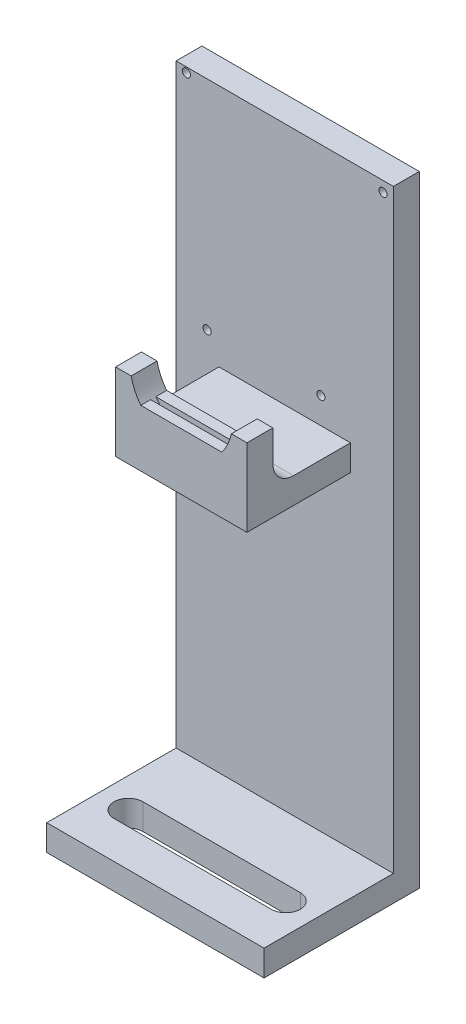
ISO-10303-21;
HEADER;
FILE_DESCRIPTION(('STEP AP214'),'2;1');
FILE_NAME('part.step','',(''),(''),'','','');
FILE_SCHEMA(('AUTOMOTIVE_DESIGN { 1 0 10303 214 1 1 1 1 }'));
ENDSEC;
DATA;
#1=APPLICATION_CONTEXT('core data for automotive mechanical design processes');
#2=APPLICATION_PROTOCOL_DEFINITION('international standard','automotive_design',2000,#1);
#3=PRODUCT_CONTEXT('',#1,'mechanical');
#4=PRODUCT('Part','Part','',(#3));
#5=PRODUCT_RELATED_PRODUCT_CATEGORY('part','',(#4));
#6=PRODUCT_DEFINITION_FORMATION('','',#4);
#7=PRODUCT_DEFINITION_CONTEXT('part definition',#1,'design');
#8=PRODUCT_DEFINITION('design','',#6,#7);
#9=PRODUCT_DEFINITION_SHAPE('','',#8);
#10=(LENGTH_UNIT() NAMED_UNIT(*) SI_UNIT(.MILLI.,.METRE.));
#11=(NAMED_UNIT(*) PLANE_ANGLE_UNIT() SI_UNIT($,.RADIAN.));
#12=(NAMED_UNIT(*) SI_UNIT($,.STERADIAN.) SOLID_ANGLE_UNIT());
#13=UNCERTAINTY_MEASURE_WITH_UNIT(LENGTH_MEASURE(1.E-05),#10,'distance_accuracy_value','');
#14=(GEOMETRIC_REPRESENTATION_CONTEXT(3) GLOBAL_UNCERTAINTY_ASSIGNED_CONTEXT((#13)) GLOBAL_UNIT_ASSIGNED_CONTEXT((#10,
#11,#12)) REPRESENTATION_CONTEXT('',''));
#15=CARTESIAN_POINT('',(0.,0.,0.));
#16=DIRECTION('',(0.,0.,1.));
#17=DIRECTION('',(1.,0.,0.));
#18=AXIS2_PLACEMENT_3D('',#15,#16,#17);
#19=CARTESIAN_POINT('',(0.,0.,6.35));
#20=DIRECTION('',(0.,0.,1.));
#21=DIRECTION('',(1.,0.,0.));
#22=AXIS2_PLACEMENT_3D('',#19,#20,#21);
#23=PLANE('',#22);
#24=CARTESIAN_POINT('',(-41.2214457831326,121.690481927711,6.35));
#25=DIRECTION('',(0.,0.,1.));
#26=DIRECTION('',(1.,0.,0.));
#27=AXIS2_PLACEMENT_3D('',#24,#25,#26);
#28=CIRCLE('',#27,0.999999999999998);
#29=CARTESIAN_POINT('',(-40.2214457831326,121.690481927711,6.35));
#30=VERTEX_POINT('',#29);
#31=EDGE_CURVE('E371',#30,#30,#28,.T.);
#32=ORIENTED_EDGE('',*,*,#31,.F.);
#33=EDGE_LOOP('',(#32));
#34=FACE_BOUND('',#33,.T.);
#35=CARTESIAN_POINT('',(-36.1414457831326,69.6204819277108,6.35));
#36=DIRECTION('',(0.,0.,1.));
#37=DIRECTION('',(1.,0.,0.));
#38=AXIS2_PLACEMENT_3D('',#35,#36,#37);
#39=CIRCLE('',#38,0.999999999999998);
#40=CARTESIAN_POINT('',(-35.1414457831326,69.6204819277108,6.35));
#41=VERTEX_POINT('',#40);
#42=EDGE_CURVE('E387',#41,#41,#39,.T.);
#43=ORIENTED_EDGE('',*,*,#42,.F.);
#44=EDGE_LOOP('',(#43));
#45=FACE_BOUND('',#44,.T.);
#46=CARTESIAN_POINT('',(-8.20144578313258,69.6204819277108,6.35));
#47=DIRECTION('',(0.,0.,1.));
#48=DIRECTION('',(1.,0.,0.));
#49=AXIS2_PLACEMENT_3D('',#46,#47,#48);
#50=CIRCLE('',#49,1.);
#51=CARTESIAN_POINT('',(-7.20144578313259,69.6204819277108,6.35));
#52=VERTEX_POINT('',#51);
#53=EDGE_CURVE('E379',#52,#52,#50,.T.);
#54=ORIENTED_EDGE('',*,*,#53,.F.);
#55=EDGE_LOOP('',(#54));
#56=FACE_BOUND('',#55,.T.);
#57=CARTESIAN_POINT('',(7.0385542168674,120.420481927711,6.35));
#58=DIRECTION('',(0.,0.,1.));
#59=DIRECTION('',(1.,0.,0.));
#60=AXIS2_PLACEMENT_3D('',#57,#58,#59);
#61=CIRCLE('',#60,1.);
#62=CARTESIAN_POINT('',(8.0385542168674,120.420481927711,6.35));
#63=VERTEX_POINT('',#62);
#64=EDGE_CURVE('E363',#63,#63,#61,.T.);
#65=ORIENTED_EDGE('',*,*,#64,.F.);
#66=EDGE_LOOP('',(#65));
#67=FACE_BOUND('',#66,.T.);
#68=DIRECTION('',(-1.,0.,0.));
#69=VECTOR('',#68,1.);
#70=CARTESIAN_POINT('',(0.,56.839063863778,6.35));
#71=LINE('',#70,#69);
#72=CARTESIAN_POINT('',(-0.962445783132593,56.839063863778,6.35));
#73=VERTEX_POINT('',#72);
#74=CARTESIAN_POINT('',(-33.2204457831326,56.839063863778,6.35));
#75=VERTEX_POINT('',#74);
#76=EDGE_CURVE('E354',#73,#75,#71,.T.);
#77=ORIENTED_EDGE('',*,*,#76,.T.);
#78=DIRECTION('',(0.,1.,0.));
#79=VECTOR('',#78,1.);
#80=CARTESIAN_POINT('',(-33.2204457831326,0.,6.35));
#81=LINE('',#80,#79);
#82=CARTESIAN_POINT('',(-33.2204457831326,63.189063863778,6.35));
#83=VERTEX_POINT('',#82);
#84=EDGE_CURVE('E358',#75,#83,#81,.T.);
#85=ORIENTED_EDGE('',*,*,#84,.T.);
#86=DIRECTION('',(1.,0.,0.));
#87=VECTOR('',#86,1.);
#88=CARTESIAN_POINT('',(0.,63.189063863778,6.35));
#89=LINE('',#88,#87);
#90=CARTESIAN_POINT('',(-0.962445783132593,63.189063863778,6.35));
#91=VERTEX_POINT('',#90);
#92=EDGE_CURVE('E346',#83,#91,#89,.T.);
#93=ORIENTED_EDGE('',*,*,#92,.T.);
#94=DIRECTION('',(0.,-1.,0.));
#95=VECTOR('',#94,1.);
#96=CARTESIAN_POINT('',(-0.962445783132593,0.,6.35));
#97=LINE('',#96,#95);
#98=EDGE_CURVE('E350',#91,#73,#97,.T.);
#99=ORIENTED_EDGE('',*,*,#98,.T.);
#100=EDGE_LOOP('',(#77,#85,#93,#99));
#101=FACE_BOUND('',#100,.T.);
#102=DIRECTION('',(0.,-1.,0.));
#103=VECTOR('',#102,1.);
#104=CARTESIAN_POINT('',(-43.7614457831326,122.960481927711,6.35));
#105=LINE('',#104,#103);
#106=CARTESIAN_POINT('',(-43.7614457831326,122.960481927711,6.35));
#107=VERTEX_POINT('',#106);
#108=CARTESIAN_POINT('',(-43.7614457831326,-23.0895180722891,6.35));
#109=VERTEX_POINT('',#108);
#110=EDGE_CURVE('E395',#107,#109,#105,.T.);
#111=ORIENTED_EDGE('',*,*,#110,.T.);
#112=DIRECTION('',(-1.,0.,0.));
#113=VECTOR('',#112,1.);
#114=CARTESIAN_POINT('',(-43.7614457831326,-23.0895180722892,6.35));
#115=LINE('',#114,#113);
#116=CARTESIAN_POINT('',(9.57855421686743,-23.0895180722892,6.35));
#117=VERTEX_POINT('',#116);
#118=EDGE_CURVE('E212',#117,#109,#115,.T.);
#119=ORIENTED_EDGE('',*,*,#118,.F.);
#120=DIRECTION('',(0.,1.,0.));
#121=VECTOR('',#120,1.);
#122=CARTESIAN_POINT('',(9.57855421686741,122.960481927711,6.35));
#123=LINE('',#122,#121);
#124=CARTESIAN_POINT('',(9.57855421686741,122.960481927711,6.35));
#125=VERTEX_POINT('',#124);
#126=EDGE_CURVE('E398',#117,#125,#123,.T.);
#127=ORIENTED_EDGE('',*,*,#126,.T.);
#128=DIRECTION('',(-1.,0.,0.));
#129=VECTOR('',#128,1.);
#130=CARTESIAN_POINT('',(-43.7614457831326,122.960481927711,6.35));
#131=LINE('',#130,#129);
#132=EDGE_CURVE('E402',#125,#107,#131,.T.);
#133=ORIENTED_EDGE('',*,*,#132,.T.);
#134=EDGE_LOOP('',(#111,#119,#127,#133));
#135=FACE_BOUND('',#134,.T.);
#136=ADVANCED_FACE('F41',(#34,#45,#56,#67,#101,#135),#23,.T.);
#137=CARTESIAN_POINT('',(0.,75.889063863778,0.));
#138=DIRECTION('',(0.,-1.,0.));
#139=DIRECTION('',(0.,0.,-1.));
#140=AXIS2_PLACEMENT_3D('',#137,#138,#139);
#141=PLANE('',#140);
#142=DIRECTION('',(-1.,0.,0.));
#143=VECTOR('',#142,1.);
#144=CARTESIAN_POINT('',(-33.2204457831326,75.889063863778,25.4));
#145=LINE('',#144,#143);
#146=CARTESIAN_POINT('',(-0.962445783132593,75.889063863778,25.4));
#147=VERTEX_POINT('',#146);
#148=CARTESIAN_POINT('',(-4.7947593866237,75.889063863778,25.4));
#149=VERTEX_POINT('',#148);
#150=EDGE_CURVE('E311',#147,#149,#145,.T.);
#151=ORIENTED_EDGE('',*,*,#150,.T.);
#152=DIRECTION('',(0.,0.,1.));
#153=VECTOR('',#152,1.);
#154=CARTESIAN_POINT('',(-4.7947593866237,75.889063863778,-0.001000000000001));
#155=LINE('',#154,#153);
#156=CARTESIAN_POINT('',(-4.7947593866237,75.889063863778,31.75));
#157=VERTEX_POINT('',#156);
#158=EDGE_CURVE('E285',#157,#149,#155,.F.);
#159=ORIENTED_EDGE('',*,*,#158,.F.);
#160=DIRECTION('',(1.,0.,0.));
#161=VECTOR('',#160,1.);
#162=CARTESIAN_POINT('',(-33.2204457831326,75.889063863778,31.75));
#163=LINE('',#162,#161);
#164=CARTESIAN_POINT('',(-0.962445783132593,75.889063863778,31.75));
#165=VERTEX_POINT('',#164);
#166=EDGE_CURVE('E302',#157,#165,#163,.T.);
#167=ORIENTED_EDGE('',*,*,#166,.T.);
#168=DIRECTION('',(0.,0.,-1.));
#169=VECTOR('',#168,1.);
#170=CARTESIAN_POINT('',(-0.962445783132593,75.889063863778,31.75));
#171=LINE('',#170,#169);
#172=EDGE_CURVE('E307',#165,#147,#171,.T.);
#173=ORIENTED_EDGE('',*,*,#172,.T.);
#174=EDGE_LOOP('',(#151,#159,#167,#173));
#175=FACE_BOUND('',#174,.T.);
#176=ADVANCED_FACE('F488',(#175),#141,.F.);
#177=CARTESIAN_POINT('',(-33.2204457831326,63.189063863778,31.75));
#178=DIRECTION('',(0.,-1.,0.));
#179=DIRECTION('',(0.,0.,-1.));
#180=AXIS2_PLACEMENT_3D('',#177,#178,#179);
#181=PLANE('',#180);
#182=DIRECTION('',(0.,0.,-1.));
#183=VECTOR('',#182,1.);
#184=CARTESIAN_POINT('',(-33.2204457831326,63.189063863778,31.75));
#185=LINE('',#184,#183);
#186=CARTESIAN_POINT('',(-33.2204457831326,63.189063863778,20.32));
#187=VERTEX_POINT('',#186);
#188=EDGE_CURVE('E332',#187,#83,#185,.T.);
#189=ORIENTED_EDGE('',*,*,#188,.F.);
#190=DIRECTION('',(-1.,0.,0.));
#191=VECTOR('',#190,1.);
#192=CARTESIAN_POINT('',(-0.962445783132593,63.189063863778,20.32));
#193=LINE('',#192,#191);
#194=CARTESIAN_POINT('',(-0.962445783132593,63.189063863778,20.32));
#195=VERTEX_POINT('',#194);
#196=EDGE_CURVE('E459',#187,#195,#193,.F.);
#197=ORIENTED_EDGE('',*,*,#196,.T.);
#198=DIRECTION('',(0.,0.,-1.));
#199=VECTOR('',#198,1.);
#200=CARTESIAN_POINT('',(-0.962445783132593,63.189063863778,31.75));
#201=LINE('',#200,#199);
#202=EDGE_CURVE('E335',#195,#91,#201,.T.);
#203=ORIENTED_EDGE('',*,*,#202,.T.);
#204=ORIENTED_EDGE('',*,*,#92,.F.);
#205=EDGE_LOOP('',(#189,#197,#203,#204));
#206=FACE_BOUND('',#205,.T.);
#207=ADVANCED_FACE('F473',(#206),#181,.F.);
#208=CARTESIAN_POINT('',(0.,0.,0.));
#209=DIRECTION('',(0.,0.,1.));
#210=DIRECTION('',(1.,0.,0.));
#211=AXIS2_PLACEMENT_3D('',#208,#209,#210);
#212=PLANE('',#211);
#213=CARTESIAN_POINT('',(7.0385542168674,120.420481927711,0.));
#214=DIRECTION('',(0.,0.,1.));
#215=DIRECTION('',(1.,0.,0.));
#216=AXIS2_PLACEMENT_3D('',#213,#214,#215);
#217=CIRCLE('',#216,1.);
#218=CARTESIAN_POINT('',(8.0385542168674,120.420481927711,0.));
#219=VERTEX_POINT('',#218);
#220=EDGE_CURVE('E362',#219,#219,#217,.T.);
#221=ORIENTED_EDGE('',*,*,#220,.T.);
#222=EDGE_LOOP('',(#221));
#223=FACE_BOUND('',#222,.T.);
#224=CARTESIAN_POINT('',(-41.2214457831326,121.690481927711,0.));
#225=DIRECTION('',(0.,0.,1.));
#226=DIRECTION('',(1.,0.,0.));
#227=AXIS2_PLACEMENT_3D('',#224,#225,#226);
#228=CIRCLE('',#227,0.999999999999998);
#229=CARTESIAN_POINT('',(-40.2214457831326,121.690481927711,0.));
#230=VERTEX_POINT('',#229);
#231=EDGE_CURVE('E367',#230,#230,#228,.T.);
#232=ORIENTED_EDGE('',*,*,#231,.T.);
#233=EDGE_LOOP('',(#232));
#234=FACE_BOUND('',#233,.T.);
#235=CARTESIAN_POINT('',(-8.20144578313258,69.6204819277108,0.));
#236=DIRECTION('',(0.,0.,1.));
#237=DIRECTION('',(1.,0.,0.));
#238=AXIS2_PLACEMENT_3D('',#235,#236,#237);
#239=CIRCLE('',#238,1.);
#240=CARTESIAN_POINT('',(-7.20144578313259,69.6204819277108,0.));
#241=VERTEX_POINT('',#240);
#242=EDGE_CURVE('E375',#241,#241,#239,.T.);
#243=ORIENTED_EDGE('',*,*,#242,.T.);
#244=EDGE_LOOP('',(#243));
#245=FACE_BOUND('',#244,.T.);
#246=CARTESIAN_POINT('',(-36.1414457831326,69.6204819277108,0.));
#247=DIRECTION('',(0.,0.,1.));
#248=DIRECTION('',(1.,0.,0.));
#249=AXIS2_PLACEMENT_3D('',#246,#247,#248);
#250=CIRCLE('',#249,0.999999999999998);
#251=CARTESIAN_POINT('',(-35.1414457831326,69.6204819277108,0.));
#252=VERTEX_POINT('',#251);
#253=EDGE_CURVE('E383',#252,#252,#250,.T.);
#254=ORIENTED_EDGE('',*,*,#253,.T.);
#255=EDGE_LOOP('',(#254));
#256=FACE_BOUND('',#255,.T.);
#257=DIRECTION('',(0.,-1.,0.));
#258=VECTOR('',#257,1.);
#259=CARTESIAN_POINT('',(-43.7614457831326,122.960481927711,0.));
#260=LINE('',#259,#258);
#261=CARTESIAN_POINT('',(-43.7614457831326,122.960481927711,0.));
#262=VERTEX_POINT('',#261);
#263=CARTESIAN_POINT('',(-43.7614457831326,-29.4395180722892,0.));
#264=VERTEX_POINT('',#263);
#265=EDGE_CURVE('E391',#262,#264,#260,.T.);
#266=ORIENTED_EDGE('',*,*,#265,.F.);
#267=DIRECTION('',(-1.,0.,0.));
#268=VECTOR('',#267,1.);
#269=CARTESIAN_POINT('',(-43.7614457831326,122.960481927711,0.));
#270=LINE('',#269,#268);
#271=CARTESIAN_POINT('',(9.57855421686741,122.960481927711,0.));
#272=VERTEX_POINT('',#271);
#273=EDGE_CURVE('E399',#272,#262,#270,.T.);
#274=ORIENTED_EDGE('',*,*,#273,.F.);
#275=DIRECTION('',(0.,1.,0.));
#276=VECTOR('',#275,1.);
#277=CARTESIAN_POINT('',(9.57855421686741,122.960481927711,0.));
#278=LINE('',#277,#276);
#279=CARTESIAN_POINT('',(9.57855421686743,-29.4395180722892,0.));
#280=VERTEX_POINT('',#279);
#281=EDGE_CURVE('E412',#280,#272,#278,.T.);
#282=ORIENTED_EDGE('',*,*,#281,.F.);
#283=DIRECTION('',(1.,0.,0.));
#284=VECTOR('',#283,1.);
#285=CARTESIAN_POINT('',(-43.7614457831326,-29.4395180722892,0.));
#286=LINE('',#285,#284);
#287=EDGE_CURVE('E409',#264,#280,#286,.T.);
#288=ORIENTED_EDGE('',*,*,#287,.F.);
#289=EDGE_LOOP('',(#266,#274,#282,#288));
#290=FACE_BOUND('',#289,.T.);
#291=ADVANCED_FACE('F545',(#223,#234,#245,#256,#290),#212,.F.);
#292=CARTESIAN_POINT('',(-43.7614457831326,122.960481927711,6.35));
#293=DIRECTION('',(1.,0.,0.));
#294=DIRECTION('',(0.,1.,0.));
#295=AXIS2_PLACEMENT_3D('',#292,#293,#294);
#296=PLANE('',#295);
#297=ORIENTED_EDGE('',*,*,#265,.T.);
#298=DIRECTION('',(0.,0.,-1.));
#299=VECTOR('',#298,1.);
#300=CARTESIAN_POINT('',(-43.7614457831326,-29.4395180722892,6.35));
#301=LINE('',#300,#299);
#302=CARTESIAN_POINT('',(-43.7614457831326,-29.4395180722892,38.1));
#303=VERTEX_POINT('',#302);
#304=EDGE_CURVE('E428',#303,#264,#301,.T.);
#305=ORIENTED_EDGE('',*,*,#304,.F.);
#306=DIRECTION('',(0.,-1.,0.));
#307=VECTOR('',#306,1.);
#308=CARTESIAN_POINT('',(-43.7614457831326,-29.4395180722892,38.1));
#309=LINE('',#308,#307);
#310=CARTESIAN_POINT('',(-43.7614457831326,-23.0895180722892,38.1));
#311=VERTEX_POINT('',#310);
#312=EDGE_CURVE('E244',#311,#303,#309,.T.);
#313=ORIENTED_EDGE('',*,*,#312,.F.);
#314=DIRECTION('',(0.,0.,-1.));
#315=VECTOR('',#314,1.);
#316=CARTESIAN_POINT('',(-43.7614457831326,-23.0895180722892,38.1));
#317=LINE('',#316,#315);
#318=EDGE_CURVE('E258',#311,#109,#317,.T.);
#319=ORIENTED_EDGE('',*,*,#318,.T.);
#320=ORIENTED_EDGE('',*,*,#110,.F.);
#321=DIRECTION('',(0.,0.,-1.));
#322=VECTOR('',#321,1.);
#323=CARTESIAN_POINT('',(-43.7614457831326,122.960481927711,6.35));
#324=LINE('',#323,#322);
#325=EDGE_CURVE('E405',#107,#262,#324,.T.);
#326=ORIENTED_EDGE('',*,*,#325,.T.);
#327=EDGE_LOOP('',(#297,#305,#313,#319,#320,#326));
#328=FACE_BOUND('',#327,.T.);
#329=ADVANCED_FACE('F548',(#328),#296,.F.);
#330=CARTESIAN_POINT('',(-43.7614457831326,-29.4395180722892,6.35));
#331=DIRECTION('',(0.,1.,0.));
#332=DIRECTION('',(0.,0.,1.));
#333=AXIS2_PLACEMENT_3D('',#330,#331,#332);
#334=PLANE('',#333);
#335=DIRECTION('',(1.,0.,0.));
#336=VECTOR('',#335,1.);
#337=CARTESIAN_POINT('',(-36.3954457831326,-29.4395180722892,21.844));
#338=LINE('',#337,#336);
#339=CARTESIAN_POINT('',(-36.3954457831326,-29.4395180722892,21.844));
#340=VERTEX_POINT('',#339);
#341=CARTESIAN_POINT('',(2.21255421686743,-29.4395180722892,21.844));
#342=VERTEX_POINT('',#341);
#343=EDGE_CURVE('E218',#340,#342,#338,.T.);
#344=ORIENTED_EDGE('',*,*,#343,.F.);
#345=CARTESIAN_POINT('',(-36.3954457831326,-29.4395180722892,25.4));
#346=DIRECTION('',(0.,1.,0.));
#347=DIRECTION('',(0.,0.,1.));
#348=AXIS2_PLACEMENT_3D('',#345,#346,#347);
#349=CIRCLE('',#348,3.55600000000001);
#350=CARTESIAN_POINT('',(-36.3954457831326,-29.4395180722892,28.956));
#351=VERTEX_POINT('',#350);
#352=EDGE_CURVE('E198',#351,#340,#349,.F.);
#353=ORIENTED_EDGE('',*,*,#352,.F.);
#354=DIRECTION('',(-1.,0.,0.));
#355=VECTOR('',#354,1.);
#356=CARTESIAN_POINT('',(-36.3954457831326,-29.4395180722892,28.956));
#357=LINE('',#356,#355);
#358=CARTESIAN_POINT('',(2.21255421686743,-29.4395180722892,28.956));
#359=VERTEX_POINT('',#358);
#360=EDGE_CURVE('E208',#359,#351,#357,.T.);
#361=ORIENTED_EDGE('',*,*,#360,.F.);
#362=CARTESIAN_POINT('',(2.21255421686743,-29.4395180722892,25.4));
#363=DIRECTION('',(0.,1.,0.));
#364=DIRECTION('',(0.,0.,1.));
#365=AXIS2_PLACEMENT_3D('',#362,#363,#364);
#366=CIRCLE('',#365,3.556);
#367=EDGE_CURVE('E57',#342,#359,#366,.F.);
#368=ORIENTED_EDGE('',*,*,#367,.F.);
#369=EDGE_LOOP('',(#344,#353,#361,#368));
#370=FACE_BOUND('',#369,.T.);
#371=ORIENTED_EDGE('',*,*,#287,.T.);
#372=DIRECTION('',(0.,0.,-1.));
#373=VECTOR('',#372,1.);
#374=CARTESIAN_POINT('',(9.57855421686743,-29.4395180722892,6.35));
#375=LINE('',#374,#373);
#376=CARTESIAN_POINT('',(9.57855421686743,-29.4395180722892,38.1));
#377=VERTEX_POINT('',#376);
#378=EDGE_CURVE('E424',#377,#280,#375,.T.);
#379=ORIENTED_EDGE('',*,*,#378,.F.);
#380=DIRECTION('',(1.,0.,0.));
#381=VECTOR('',#380,1.);
#382=CARTESIAN_POINT('',(-43.7614457831326,-29.4395180722892,38.1));
#383=LINE('',#382,#381);
#384=EDGE_CURVE('E248',#303,#377,#383,.T.);
#385=ORIENTED_EDGE('',*,*,#384,.F.);
#386=ORIENTED_EDGE('',*,*,#304,.T.);
#387=EDGE_LOOP('',(#371,#379,#385,#386));
#388=FACE_BOUND('',#387,.T.);
#389=ADVANCED_FACE('F215',(#370,#388),#334,.F.);
#390=CARTESIAN_POINT('',(9.57855421686741,122.960481927711,6.35));
#391=DIRECTION('',(-1.,0.,0.));
#392=DIRECTION('',(0.,-1.,0.));
#393=AXIS2_PLACEMENT_3D('',#390,#391,#392);
#394=PLANE('',#393);
#395=ORIENTED_EDGE('',*,*,#281,.T.);
#396=DIRECTION('',(0.,0.,-1.));
#397=VECTOR('',#396,1.);
#398=CARTESIAN_POINT('',(9.57855421686741,122.960481927711,6.35));
#399=LINE('',#398,#397);
#400=EDGE_CURVE('E420',#125,#272,#399,.T.);
#401=ORIENTED_EDGE('',*,*,#400,.F.);
#402=ORIENTED_EDGE('',*,*,#126,.F.);
#403=DIRECTION('',(0.,0.,-1.));
#404=VECTOR('',#403,1.);
#405=CARTESIAN_POINT('',(9.57855421686743,-23.0895180722892,38.1));
#406=LINE('',#405,#404);
#407=CARTESIAN_POINT('',(9.57855421686743,-23.0895180722892,38.1));
#408=VERTEX_POINT('',#407);
#409=EDGE_CURVE('E265',#408,#117,#406,.T.);
#410=ORIENTED_EDGE('',*,*,#409,.F.);
#411=DIRECTION('',(0.,1.,0.));
#412=VECTOR('',#411,1.);
#413=CARTESIAN_POINT('',(9.57855421686743,-29.4395180722892,38.1));
#414=LINE('',#413,#412);
#415=EDGE_CURVE('E252',#377,#408,#414,.T.);
#416=ORIENTED_EDGE('',*,*,#415,.F.);
#417=ORIENTED_EDGE('',*,*,#378,.T.);
#418=EDGE_LOOP('',(#395,#401,#402,#410,#416,#417));
#419=FACE_BOUND('',#418,.T.);
#420=ADVANCED_FACE('F553',(#419),#394,.F.);
#421=CARTESIAN_POINT('',(-43.7614457831326,122.960481927711,6.35));
#422=DIRECTION('',(0.,-1.,0.));
#423=DIRECTION('',(0.,0.,-1.));
#424=AXIS2_PLACEMENT_3D('',#421,#422,#423);
#425=PLANE('',#424);
#426=ORIENTED_EDGE('',*,*,#273,.T.);
#427=ORIENTED_EDGE('',*,*,#325,.F.);
#428=ORIENTED_EDGE('',*,*,#132,.F.);
#429=ORIENTED_EDGE('',*,*,#400,.T.);
#430=EDGE_LOOP('',(#426,#427,#428,#429));
#431=FACE_BOUND('',#430,.T.);
#432=ADVANCED_FACE('F550',(#431),#425,.F.);
#433=CARTESIAN_POINT('',(-36.1414457831326,69.6204819277108,6.35));
#434=DIRECTION('',(0.,0.,-1.));
#435=DIRECTION('',(-1.,0.,0.));
#436=AXIS2_PLACEMENT_3D('',#433,#434,#435);
#437=CYLINDRICAL_SURFACE('',#436,0.999999999999998);
#438=ORIENTED_EDGE('',*,*,#42,.T.);
#439=EDGE_LOOP('',(#438));
#440=FACE_BOUND('',#439,.T.);
#441=ORIENTED_EDGE('',*,*,#253,.F.);
#442=EDGE_LOOP('',(#441));
#443=FACE_BOUND('',#442,.T.);
#444=ADVANCED_FACE('F543',(#440,#443),#437,.F.);
#445=CARTESIAN_POINT('',(-8.20144578313258,69.6204819277108,6.35));
#446=DIRECTION('',(0.,0.,-1.));
#447=DIRECTION('',(-1.,0.,0.));
#448=AXIS2_PLACEMENT_3D('',#445,#446,#447);
#449=CYLINDRICAL_SURFACE('',#448,1.);
#450=ORIENTED_EDGE('',*,*,#53,.T.);
#451=EDGE_LOOP('',(#450));
#452=FACE_BOUND('',#451,.T.);
#453=ORIENTED_EDGE('',*,*,#242,.F.);
#454=EDGE_LOOP('',(#453));
#455=FACE_BOUND('',#454,.T.);
#456=ADVANCED_FACE('F708',(#452,#455),#449,.F.);
#457=CARTESIAN_POINT('',(-41.2214457831326,121.690481927711,6.35));
#458=DIRECTION('',(0.,0.,-1.));
#459=DIRECTION('',(-1.,0.,0.));
#460=AXIS2_PLACEMENT_3D('',#457,#458,#459);
#461=CYLINDRICAL_SURFACE('',#460,0.999999999999998);
#462=ORIENTED_EDGE('',*,*,#31,.T.);
#463=EDGE_LOOP('',(#462));
#464=FACE_BOUND('',#463,.T.);
#465=ORIENTED_EDGE('',*,*,#231,.F.);
#466=EDGE_LOOP('',(#465));
#467=FACE_BOUND('',#466,.T.);
#468=ADVANCED_FACE('F716',(#464,#467),#461,.F.);
#469=CARTESIAN_POINT('',(7.0385542168674,120.420481927711,6.35));
#470=DIRECTION('',(0.,0.,-1.));
#471=DIRECTION('',(-1.,0.,0.));
#472=AXIS2_PLACEMENT_3D('',#469,#470,#471);
#473=CYLINDRICAL_SURFACE('',#472,1.);
#474=ORIENTED_EDGE('',*,*,#64,.T.);
#475=EDGE_LOOP('',(#474));
#476=FACE_BOUND('',#475,.T.);
#477=ORIENTED_EDGE('',*,*,#220,.F.);
#478=EDGE_LOOP('',(#477));
#479=FACE_BOUND('',#478,.T.);
#480=ADVANCED_FACE('F724',(#476,#479),#473,.F.);
#481=CARTESIAN_POINT('',(-33.2204457831326,63.189063863778,31.75));
#482=DIRECTION('',(1.,0.,0.));
#483=DIRECTION('',(0.,0.,-1.));
#484=AXIS2_PLACEMENT_3D('',#481,#482,#483);
#485=PLANE('',#484);
#486=DIRECTION('',(0.,0.,-1.));
#487=VECTOR('',#486,1.);
#488=CARTESIAN_POINT('',(-33.2204457831326,56.839063863778,31.75));
#489=LINE('',#488,#487);
#490=CARTESIAN_POINT('',(-33.2204457831326,56.839063863778,31.75));
#491=VERTEX_POINT('',#490);
#492=EDGE_CURVE('E342',#491,#75,#489,.T.);
#493=ORIENTED_EDGE('',*,*,#492,.F.);
#494=DIRECTION('',(0.,-1.,0.));
#495=VECTOR('',#494,1.);
#496=CARTESIAN_POINT('',(-33.2204457831326,63.189063863778,31.75));
#497=LINE('',#496,#495);
#498=CARTESIAN_POINT('',(-33.2204457831326,75.889063863778,31.75));
#499=VERTEX_POINT('',#498);
#500=EDGE_CURVE('E323',#499,#491,#497,.T.);
#501=ORIENTED_EDGE('',*,*,#500,.F.);
#502=DIRECTION('',(0.,0.,1.));
#503=VECTOR('',#502,1.);
#504=CARTESIAN_POINT('',(-33.2204457831326,75.889063863778,31.75));
#505=LINE('',#504,#503);
#506=CARTESIAN_POINT('',(-33.2204457831326,75.889063863778,25.4));
#507=VERTEX_POINT('',#506);
#508=EDGE_CURVE('E298',#507,#499,#505,.T.);
#509=ORIENTED_EDGE('',*,*,#508,.F.);
#510=DIRECTION('',(0.,-1.,0.));
#511=VECTOR('',#510,1.);
#512=CARTESIAN_POINT('',(-33.2204457831326,75.889063863778,25.4));
#513=LINE('',#512,#511);
#514=CARTESIAN_POINT('',(-33.2204457831326,68.269063863778,25.4));
#515=VERTEX_POINT('',#514);
#516=EDGE_CURVE('E315',#507,#515,#513,.T.);
#517=ORIENTED_EDGE('',*,*,#516,.T.);
#518=CARTESIAN_POINT('',(-33.2204457831326,68.269063863778,20.32));
#519=DIRECTION('',(1.,0.,0.));
#520=DIRECTION('',(0.,0.,-1.));
#521=AXIS2_PLACEMENT_3D('',#518,#519,#520);
#522=CIRCLE('',#521,5.08);
#523=EDGE_CURVE('E50',#515,#187,#522,.T.);
#524=ORIENTED_EDGE('',*,*,#523,.T.);
#525=ORIENTED_EDGE('',*,*,#188,.T.);
#526=ORIENTED_EDGE('',*,*,#84,.F.);
#527=EDGE_LOOP('',(#493,#501,#509,#517,#524,#525,#526));
#528=FACE_BOUND('',#527,.T.);
#529=ADVANCED_FACE('F465',(#528),#485,.F.);
#530=CARTESIAN_POINT('',(-33.2204457831326,56.839063863778,31.75));
#531=DIRECTION('',(0.,1.,0.));
#532=DIRECTION('',(-1.,0.,0.));
#533=AXIS2_PLACEMENT_3D('',#530,#531,#532);
#534=PLANE('',#533);
#535=ORIENTED_EDGE('',*,*,#76,.F.);
#536=DIRECTION('',(0.,0.,-1.));
#537=VECTOR('',#536,1.);
#538=CARTESIAN_POINT('',(-0.962445783132593,56.839063863778,31.75));
#539=LINE('',#538,#537);
#540=CARTESIAN_POINT('',(-0.962445783132593,56.839063863778,31.75));
#541=VERTEX_POINT('',#540);
#542=EDGE_CURVE('E338',#541,#73,#539,.T.);
#543=ORIENTED_EDGE('',*,*,#542,.F.);
#544=DIRECTION('',(1.,0.,0.));
#545=VECTOR('',#544,1.);
#546=CARTESIAN_POINT('',(-33.2204457831326,56.839063863778,31.75));
#547=LINE('',#546,#545);
#548=EDGE_CURVE('E326',#491,#541,#547,.T.);
#549=ORIENTED_EDGE('',*,*,#548,.F.);
#550=ORIENTED_EDGE('',*,*,#492,.T.);
#551=EDGE_LOOP('',(#535,#543,#549,#550));
#552=FACE_BOUND('',#551,.T.);
#553=ADVANCED_FACE('F499',(#552),#534,.F.);
#554=CARTESIAN_POINT('',(-0.962445783132593,63.189063863778,31.75));
#555=DIRECTION('',(-1.,0.,0.));
#556=DIRECTION('',(0.,0.,1.));
#557=AXIS2_PLACEMENT_3D('',#554,#555,#556);
#558=PLANE('',#557);
#559=ORIENTED_EDGE('',*,*,#172,.F.);
#560=DIRECTION('',(0.,1.,0.));
#561=VECTOR('',#560,1.);
#562=CARTESIAN_POINT('',(-0.962445783132593,63.189063863778,31.75));
#563=LINE('',#562,#561);
#564=EDGE_CURVE('E329',#541,#165,#563,.T.);
#565=ORIENTED_EDGE('',*,*,#564,.F.);
#566=ORIENTED_EDGE('',*,*,#542,.T.);
#567=ORIENTED_EDGE('',*,*,#98,.F.);
#568=ORIENTED_EDGE('',*,*,#202,.F.);
#569=CARTESIAN_POINT('',(-0.962445783132593,68.269063863778,20.32));
#570=DIRECTION('',(-1.,0.,0.));
#571=DIRECTION('',(0.,0.,1.));
#572=AXIS2_PLACEMENT_3D('',#569,#570,#571);
#573=CIRCLE('',#572,5.08);
#574=CARTESIAN_POINT('',(-0.962445783132593,68.269063863778,25.4));
#575=VERTEX_POINT('',#574);
#576=EDGE_CURVE('E11',#195,#575,#573,.T.);
#577=ORIENTED_EDGE('',*,*,#576,.T.);
#578=DIRECTION('',(0.,-1.,0.));
#579=VECTOR('',#578,1.);
#580=CARTESIAN_POINT('',(-0.962445783132593,75.889063863778,25.4));
#581=LINE('',#580,#579);
#582=EDGE_CURVE('E319',#147,#575,#581,.T.);
#583=ORIENTED_EDGE('',*,*,#582,.F.);
#584=EDGE_LOOP('',(#559,#565,#566,#567,#568,#577,#583));
#585=FACE_BOUND('',#584,.T.);
#586=ADVANCED_FACE('F479',(#585),#558,.F.);
#587=CARTESIAN_POINT('',(0.,0.,31.75));
#588=DIRECTION('',(0.,0.,1.));
#589=DIRECTION('',(1.,0.,0.));
#590=AXIS2_PLACEMENT_3D('',#587,#588,#589);
#591=PLANE('',#590);
#592=ORIENTED_EDGE('',*,*,#500,.T.);
#593=ORIENTED_EDGE('',*,*,#548,.T.);
#594=ORIENTED_EDGE('',*,*,#564,.T.);
#595=ORIENTED_EDGE('',*,*,#166,.F.);
#596=CARTESIAN_POINT('',(-17.0914457831326,78.5104819277108,31.75));
#597=DIRECTION('',(0.,0.,1.));
#598=DIRECTION('',(1.,0.,0.));
#599=AXIS2_PLACEMENT_3D('',#596,#597,#598);
#600=CIRCLE('',#599,12.573);
#601=CARTESIAN_POINT('',(-7.15321209678122,70.809063863778,31.75));
#602=VERTEX_POINT('',#601);
#603=EDGE_CURVE('E288',#602,#157,#600,.T.);
#604=ORIENTED_EDGE('',*,*,#603,.F.);
#605=DIRECTION('',(1.,0.,0.));
#606=VECTOR('',#605,1.);
#607=CARTESIAN_POINT('',(-0.962445783132593,70.809063863778,31.75));
#608=LINE('',#607,#606);
#609=CARTESIAN_POINT('',(-27.0296794694839,70.809063863778,31.75));
#610=VERTEX_POINT('',#609);
#611=EDGE_CURVE('E273',#610,#602,#608,.T.);
#612=ORIENTED_EDGE('',*,*,#611,.F.);
#613=CARTESIAN_POINT('',(-29.3881321796415,75.889063863778,31.75));
#614=VERTEX_POINT('',#613);
#615=EDGE_CURVE('E289',#614,#610,#600,.T.);
#616=ORIENTED_EDGE('',*,*,#615,.F.);
#617=EDGE_CURVE('E303',#499,#614,#163,.T.);
#618=ORIENTED_EDGE('',*,*,#617,.F.);
#619=EDGE_LOOP('',(#592,#593,#594,#595,#604,#612,#616,#618));
#620=FACE_BOUND('',#619,.T.);
#621=ADVANCED_FACE('F494',(#620),#591,.T.);
#622=CARTESIAN_POINT('',(-33.2204457831326,75.889063863778,25.4));
#623=DIRECTION('',(0.,0.,1.));
#624=DIRECTION('',(1.,0.,0.));
#625=AXIS2_PLACEMENT_3D('',#622,#623,#624);
#626=PLANE('',#625);
#627=ORIENTED_EDGE('',*,*,#582,.T.);
#628=DIRECTION('',(-1.,0.,0.));
#629=VECTOR('',#628,1.);
#630=CARTESIAN_POINT('',(-33.2204457831326,68.269063863778,25.4));
#631=LINE('',#630,#629);
#632=EDGE_CURVE('E455',#575,#515,#631,.T.);
#633=ORIENTED_EDGE('',*,*,#632,.T.);
#634=ORIENTED_EDGE('',*,*,#516,.F.);
#635=CARTESIAN_POINT('',(-29.3881321796415,75.889063863778,25.4));
#636=VERTEX_POINT('',#635);
#637=EDGE_CURVE('E310',#636,#507,#145,.T.);
#638=ORIENTED_EDGE('',*,*,#637,.F.);
#639=CARTESIAN_POINT('',(-17.0914457831326,78.5104819277108,25.4));
#640=DIRECTION('',(0.,0.,1.));
#641=DIRECTION('',(1.,0.,0.));
#642=AXIS2_PLACEMENT_3D('',#639,#640,#641);
#643=CIRCLE('',#642,12.573);
#644=CARTESIAN_POINT('',(-27.0296794694839,70.809063863778,25.4));
#645=VERTEX_POINT('',#644);
#646=EDGE_CURVE('E293',#645,#636,#643,.F.);
#647=ORIENTED_EDGE('',*,*,#646,.F.);
#648=DIRECTION('',(-1.,0.,0.));
#649=VECTOR('',#648,1.);
#650=CARTESIAN_POINT('',(-33.2204457831326,70.809063863778,25.4));
#651=LINE('',#650,#649);
#652=CARTESIAN_POINT('',(-7.15321209678122,70.809063863778,25.4));
#653=VERTEX_POINT('',#652);
#654=EDGE_CURVE('E279',#653,#645,#651,.T.);
#655=ORIENTED_EDGE('',*,*,#654,.F.);
#656=EDGE_CURVE('E294',#149,#653,#643,.F.);
#657=ORIENTED_EDGE('',*,*,#656,.F.);
#658=ORIENTED_EDGE('',*,*,#150,.F.);
#659=EDGE_LOOP('',(#627,#633,#634,#638,#647,#655,#657,#658));
#660=FACE_BOUND('',#659,.T.);
#661=ADVANCED_FACE('F483',(#660),#626,.F.);
#662=ORIENTED_EDGE('',*,*,#617,.T.);
#663=DIRECTION('',(0.,0.,1.));
#664=VECTOR('',#663,1.);
#665=CARTESIAN_POINT('',(-29.3881321796415,75.889063863778,-0.001000000000001));
#666=LINE('',#665,#664);
#667=EDGE_CURVE('E282',#636,#614,#666,.T.);
#668=ORIENTED_EDGE('',*,*,#667,.F.);
#669=ORIENTED_EDGE('',*,*,#637,.T.);
#670=ORIENTED_EDGE('',*,*,#508,.T.);
#671=EDGE_LOOP('',(#662,#668,#669,#670));
#672=FACE_BOUND('',#671,.T.);
#673=ADVANCED_FACE('F506',(#672),#141,.F.);
#674=CARTESIAN_POINT('',(-17.0914457831326,78.5104819277108,-0.001000000000001));
#675=DIRECTION('',(0.,0.,1.));
#676=DIRECTION('',(1.,0.,0.));
#677=AXIS2_PLACEMENT_3D('',#674,#675,#676);
#678=CYLINDRICAL_SURFACE('',#677,12.573);
#679=ORIENTED_EDGE('',*,*,#615,.T.);
#680=DIRECTION('',(0.,0.,1.));
#681=VECTOR('',#680,1.);
#682=CARTESIAN_POINT('',(-27.0296794694839,70.809063863778,-0.001000000000001));
#683=LINE('',#682,#681);
#684=CARTESIAN_POINT('',(-27.0296794694839,70.809063863778,29.3212390471059));
#685=VERTEX_POINT('',#684);
#686=EDGE_CURVE('E451',#610,#685,#683,.F.);
#687=ORIENTED_EDGE('',*,*,#686,.T.);
#688=CARTESIAN_POINT('',(-17.0914457831326,78.5104819277108,29.3212390471059));
#689=DIRECTION('',(0.,0.,1.));
#690=DIRECTION('',(1.,0.,0.));
#691=AXIS2_PLACEMENT_3D('',#688,#689,#690);
#692=CIRCLE('',#691,12.573);
#693=CARTESIAN_POINT('',(-7.15321209678122,70.809063863778,29.3212390471059));
#694=VERTEX_POINT('',#693);
#695=EDGE_CURVE('E448',#694,#685,#692,.F.);
#696=ORIENTED_EDGE('',*,*,#695,.F.);
#697=DIRECTION('',(0.,0.,1.));
#698=VECTOR('',#697,1.);
#699=CARTESIAN_POINT('',(-7.15321209678122,70.809063863778,-0.001000000000001));
#700=LINE('',#699,#698);
#701=EDGE_CURVE('E444',#694,#602,#700,.T.);
#702=ORIENTED_EDGE('',*,*,#701,.T.);
#703=ORIENTED_EDGE('',*,*,#603,.T.);
#704=ORIENTED_EDGE('',*,*,#158,.T.);
#705=ORIENTED_EDGE('',*,*,#656,.T.);
#706=DIRECTION('',(0.,0.,1.));
#707=VECTOR('',#706,1.);
#708=CARTESIAN_POINT('',(-7.15321209678122,70.809063863778,-0.001000000000001));
#709=LINE('',#708,#707);
#710=CARTESIAN_POINT('',(-7.15321209678122,70.809063863778,28.0712390471059));
#711=VERTEX_POINT('',#710);
#712=EDGE_CURVE('E432',#653,#711,#709,.T.);
#713=ORIENTED_EDGE('',*,*,#712,.T.);
#714=CARTESIAN_POINT('',(-17.0914457831326,78.5104819277108,28.0712390471059));
#715=DIRECTION('',(0.,0.,-1.));
#716=DIRECTION('',(-1.,0.,0.));
#717=AXIS2_PLACEMENT_3D('',#714,#715,#716);
#718=CIRCLE('',#717,12.573);
#719=CARTESIAN_POINT('',(-27.0296794694839,70.809063863778,28.0712390471059));
#720=VERTEX_POINT('',#719);
#721=EDGE_CURVE('E436',#720,#711,#718,.F.);
#722=ORIENTED_EDGE('',*,*,#721,.F.);
#723=DIRECTION('',(0.,0.,1.));
#724=VECTOR('',#723,1.);
#725=CARTESIAN_POINT('',(-27.0296794694839,70.809063863778,-0.001000000000001));
#726=LINE('',#725,#724);
#727=EDGE_CURVE('E440',#720,#645,#726,.F.);
#728=ORIENTED_EDGE('',*,*,#727,.T.);
#729=ORIENTED_EDGE('',*,*,#646,.T.);
#730=ORIENTED_EDGE('',*,*,#667,.T.);
#731=EDGE_LOOP('',(#679,#687,#696,#702,#703,#704,#705,#713,#722,#728,#729,#730));
#732=FACE_BOUND('',#731,.T.);
#733=ADVANCED_FACE('F514',(#732),#678,.F.);
#734=CARTESIAN_POINT('',(-33.2204457831326,70.809063863778,28.0712390471059));
#735=DIRECTION('',(0.,0.,-1.));
#736=DIRECTION('',(-1.,0.,0.));
#737=AXIS2_PLACEMENT_3D('',#734,#735,#736);
#738=PLANE('',#737);
#739=DIRECTION('',(1.,0.,0.));
#740=VECTOR('',#739,1.);
#741=CARTESIAN_POINT('',(-33.2204457831326,70.809063863778,28.0712390471059));
#742=LINE('',#741,#740);
#743=EDGE_CURVE('E276',#720,#711,#742,.T.);
#744=ORIENTED_EDGE('',*,*,#743,.F.);
#745=ORIENTED_EDGE('',*,*,#721,.T.);
#746=EDGE_LOOP('',(#744,#745));
#747=FACE_BOUND('',#746,.T.);
#748=ADVANCED_FACE('F522',(#747),#738,.F.);
#749=CARTESIAN_POINT('',(0.,70.809063863778,0.));
#750=DIRECTION('',(0.,1.,0.));
#751=DIRECTION('',(0.,0.,1.));
#752=AXIS2_PLACEMENT_3D('',#749,#750,#751);
#753=PLANE('',#752);
#754=ORIENTED_EDGE('',*,*,#727,.F.);
#755=ORIENTED_EDGE('',*,*,#743,.T.);
#756=ORIENTED_EDGE('',*,*,#712,.F.);
#757=ORIENTED_EDGE('',*,*,#654,.T.);
#758=EDGE_LOOP('',(#754,#755,#756,#757));
#759=FACE_BOUND('',#758,.T.);
#760=ADVANCED_FACE('F519',(#759),#753,.T.);
#761=CARTESIAN_POINT('',(-0.962445783132593,70.809063863778,29.3212390471059));
#762=DIRECTION('',(0.,0.,1.));
#763=DIRECTION('',(1.,0.,0.));
#764=AXIS2_PLACEMENT_3D('',#761,#762,#763);
#765=PLANE('',#764);
#766=DIRECTION('',(-1.,0.,0.));
#767=VECTOR('',#766,1.);
#768=CARTESIAN_POINT('',(-0.962445783132593,70.809063863778,29.3212390471059));
#769=LINE('',#768,#767);
#770=EDGE_CURVE('E269',#694,#685,#769,.T.);
#771=ORIENTED_EDGE('',*,*,#770,.F.);
#772=ORIENTED_EDGE('',*,*,#695,.T.);
#773=EDGE_LOOP('',(#771,#772));
#774=FACE_BOUND('',#773,.T.);
#775=ADVANCED_FACE('F529',(#774),#765,.F.);
#776=CARTESIAN_POINT('',(0.,70.809063863778,0.));
#777=DIRECTION('',(0.,1.,0.));
#778=DIRECTION('',(0.,0.,1.));
#779=AXIS2_PLACEMENT_3D('',#776,#777,#778);
#780=PLANE('',#779);
#781=ORIENTED_EDGE('',*,*,#686,.F.);
#782=ORIENTED_EDGE('',*,*,#611,.T.);
#783=ORIENTED_EDGE('',*,*,#701,.F.);
#784=ORIENTED_EDGE('',*,*,#770,.T.);
#785=EDGE_LOOP('',(#781,#782,#783,#784));
#786=FACE_BOUND('',#785,.T.);
#787=ADVANCED_FACE('F590',(#786),#780,.T.);
#788=CARTESIAN_POINT('',(-33.2204457831326,68.269063863778,20.32));
#789=DIRECTION('',(1.,0.,0.));
#790=DIRECTION('',(0.,0.,-1.));
#791=AXIS2_PLACEMENT_3D('',#788,#789,#790);
#792=CYLINDRICAL_SURFACE('',#791,5.08);
#793=ORIENTED_EDGE('',*,*,#576,.F.);
#794=ORIENTED_EDGE('',*,*,#196,.F.);
#795=ORIENTED_EDGE('',*,*,#523,.F.);
#796=ORIENTED_EDGE('',*,*,#632,.F.);
#797=EDGE_LOOP('',(#793,#794,#795,#796));
#798=FACE_BOUND('',#797,.T.);
#799=ADVANCED_FACE('F43',(#798),#792,.F.);
#800=CARTESIAN_POINT('',(-43.7614457831326,-23.0895180722892,38.1));
#801=DIRECTION('',(0.,-1.,0.));
#802=DIRECTION('',(0.,0.,-1.));
#803=AXIS2_PLACEMENT_3D('',#800,#801,#802);
#804=PLANE('',#803);
#805=DIRECTION('',(1.,0.,0.));
#806=VECTOR('',#805,1.);
#807=CARTESIAN_POINT('',(-36.3954457831326,-23.0895180722892,28.956));
#808=LINE('',#807,#806);
#809=CARTESIAN_POINT('',(-36.3954457831326,-23.0895180722892,28.956));
#810=VERTEX_POINT('',#809);
#811=CARTESIAN_POINT('',(2.21255421686743,-23.0895180722892,28.956));
#812=VERTEX_POINT('',#811);
#813=EDGE_CURVE('E223',#810,#812,#808,.T.);
#814=ORIENTED_EDGE('',*,*,#813,.F.);
#815=CARTESIAN_POINT('',(-36.3954457831326,-23.0895180722892,25.4));
#816=DIRECTION('',(0.,1.,0.));
#817=DIRECTION('',(0.,0.,1.));
#818=AXIS2_PLACEMENT_3D('',#815,#816,#817);
#819=CIRCLE('',#818,3.55600000000001);
#820=CARTESIAN_POINT('',(-36.3954457831326,-23.0895180722892,21.844));
#821=VERTEX_POINT('',#820);
#822=EDGE_CURVE('E65',#821,#810,#819,.T.);
#823=ORIENTED_EDGE('',*,*,#822,.F.);
#824=DIRECTION('',(-1.,0.,0.));
#825=VECTOR('',#824,1.);
#826=CARTESIAN_POINT('',(-36.3954457831326,-23.0895180722892,21.844));
#827=LINE('',#826,#825);
#828=CARTESIAN_POINT('',(2.21255421686743,-23.0895180722892,21.844));
#829=VERTEX_POINT('',#828);
#830=EDGE_CURVE('E205',#829,#821,#827,.T.);
#831=ORIENTED_EDGE('',*,*,#830,.F.);
#832=CARTESIAN_POINT('',(2.21255421686743,-23.0895180722892,25.4));
#833=DIRECTION('',(0.,1.,0.));
#834=DIRECTION('',(0.,0.,1.));
#835=AXIS2_PLACEMENT_3D('',#832,#833,#834);
#836=CIRCLE('',#835,3.556);
#837=EDGE_CURVE('E230',#812,#829,#836,.T.);
#838=ORIENTED_EDGE('',*,*,#837,.F.);
#839=EDGE_LOOP('',(#814,#823,#831,#838));
#840=FACE_BOUND('',#839,.T.);
#841=ORIENTED_EDGE('',*,*,#118,.T.);
#842=ORIENTED_EDGE('',*,*,#318,.F.);
#843=DIRECTION('',(-1.,0.,0.));
#844=VECTOR('',#843,1.);
#845=CARTESIAN_POINT('',(-43.7614457831326,-23.0895180722892,38.1));
#846=LINE('',#845,#844);
#847=EDGE_CURVE('E255',#408,#311,#846,.T.);
#848=ORIENTED_EDGE('',*,*,#847,.F.);
#849=ORIENTED_EDGE('',*,*,#409,.T.);
#850=EDGE_LOOP('',(#841,#842,#848,#849));
#851=FACE_BOUND('',#850,.T.);
#852=ADVANCED_FACE('F577',(#840,#851),#804,.F.);
#853=CARTESIAN_POINT('',(0.,0.,38.1));
#854=DIRECTION('',(0.,0.,-1.));
#855=DIRECTION('',(-1.,0.,0.));
#856=AXIS2_PLACEMENT_3D('',#853,#854,#855);
#857=PLANE('',#856);
#858=ORIENTED_EDGE('',*,*,#312,.T.);
#859=ORIENTED_EDGE('',*,*,#384,.T.);
#860=ORIENTED_EDGE('',*,*,#415,.T.);
#861=ORIENTED_EDGE('',*,*,#847,.T.);
#862=EDGE_LOOP('',(#858,#859,#860,#861));
#863=FACE_BOUND('',#862,.T.);
#864=ADVANCED_FACE('F573',(#863),#857,.F.);
#865=CARTESIAN_POINT('',(-36.3954457831326,-29.4405180722892,25.4));
#866=DIRECTION('',(0.,1.,0.));
#867=DIRECTION('',(0.,0.,1.));
#868=AXIS2_PLACEMENT_3D('',#865,#866,#867);
#869=CYLINDRICAL_SURFACE('',#868,3.55600000000001);
#870=ORIENTED_EDGE('',*,*,#352,.T.);
#871=DIRECTION('',(0.,1.,0.));
#872=VECTOR('',#871,1.);
#873=CARTESIAN_POINT('',(-36.3954457831326,-29.4405180722892,21.844));
#874=LINE('',#873,#872);
#875=EDGE_CURVE('E213',#340,#821,#874,.T.);
#876=ORIENTED_EDGE('',*,*,#875,.T.);
#877=ORIENTED_EDGE('',*,*,#822,.T.);
#878=DIRECTION('',(0.,1.,0.));
#879=VECTOR('',#878,1.);
#880=CARTESIAN_POINT('',(-36.3954457831326,-29.4405180722892,28.956));
#881=LINE('',#880,#879);
#882=EDGE_CURVE('E194',#351,#810,#881,.T.);
#883=ORIENTED_EDGE('',*,*,#882,.F.);
#884=EDGE_LOOP('',(#870,#876,#877,#883));
#885=FACE_BOUND('',#884,.T.);
#886=ADVANCED_FACE('F196',(#885),#869,.F.);
#887=CARTESIAN_POINT('',(-36.3954457831326,-29.4405180722892,21.844));
#888=DIRECTION('',(0.,0.,-1.));
#889=DIRECTION('',(-1.,0.,0.));
#890=AXIS2_PLACEMENT_3D('',#887,#888,#889);
#891=PLANE('',#890);
#892=ORIENTED_EDGE('',*,*,#343,.T.);
#893=DIRECTION('',(0.,1.,0.));
#894=VECTOR('',#893,1.);
#895=CARTESIAN_POINT('',(2.21255421686743,-29.4405180722892,21.844));
#896=LINE('',#895,#894);
#897=EDGE_CURVE('E239',#342,#829,#896,.T.);
#898=ORIENTED_EDGE('',*,*,#897,.T.);
#899=ORIENTED_EDGE('',*,*,#830,.T.);
#900=ORIENTED_EDGE('',*,*,#875,.F.);
#901=EDGE_LOOP('',(#892,#898,#899,#900));
#902=FACE_BOUND('',#901,.T.);
#903=ADVANCED_FACE('F658',(#902),#891,.F.);
#904=CARTESIAN_POINT('',(2.21255421686743,-29.4405180722892,25.4));
#905=DIRECTION('',(0.,1.,0.));
#906=DIRECTION('',(0.,0.,1.));
#907=AXIS2_PLACEMENT_3D('',#904,#905,#906);
#908=CYLINDRICAL_SURFACE('',#907,3.556);
#909=ORIENTED_EDGE('',*,*,#367,.T.);
#910=DIRECTION('',(0.,1.,0.));
#911=VECTOR('',#910,1.);
#912=CARTESIAN_POINT('',(2.21255421686743,-29.4405180722892,28.956));
#913=LINE('',#912,#911);
#914=EDGE_CURVE('E204',#359,#812,#913,.T.);
#915=ORIENTED_EDGE('',*,*,#914,.T.);
#916=ORIENTED_EDGE('',*,*,#837,.T.);
#917=ORIENTED_EDGE('',*,*,#897,.F.);
#918=EDGE_LOOP('',(#909,#915,#916,#917));
#919=FACE_BOUND('',#918,.T.);
#920=ADVANCED_FACE('F666',(#919),#908,.F.);
#921=CARTESIAN_POINT('',(-36.3954457831326,-29.4405180722892,28.956));
#922=DIRECTION('',(0.,0.,1.));
#923=DIRECTION('',(1.,0.,0.));
#924=AXIS2_PLACEMENT_3D('',#921,#922,#923);
#925=PLANE('',#924);
#926=ORIENTED_EDGE('',*,*,#360,.T.);
#927=ORIENTED_EDGE('',*,*,#882,.T.);
#928=ORIENTED_EDGE('',*,*,#813,.T.);
#929=ORIENTED_EDGE('',*,*,#914,.F.);
#930=EDGE_LOOP('',(#926,#927,#928,#929));
#931=FACE_BOUND('',#930,.T.);
#932=ADVANCED_FACE('F209',(#931),#925,.F.);
#933=CLOSED_SHELL('',(#136,#176,#207,#291,#329,#389,#420,#432,#444,#456,#468,#480,#529,#553,
#586,#621,#661,#673,#733,#748,#760,#775,#787,#799,#852,#864,#886,#903,#920,#932));
#934=MANIFOLD_SOLID_BREP('B2',#933);
#935=ADVANCED_BREP_SHAPE_REPRESENTATION('',(#18,#934),#14);
#936=SHAPE_DEFINITION_REPRESENTATION(#9,#935);
ENDSEC;
END-ISO-10303-21;
